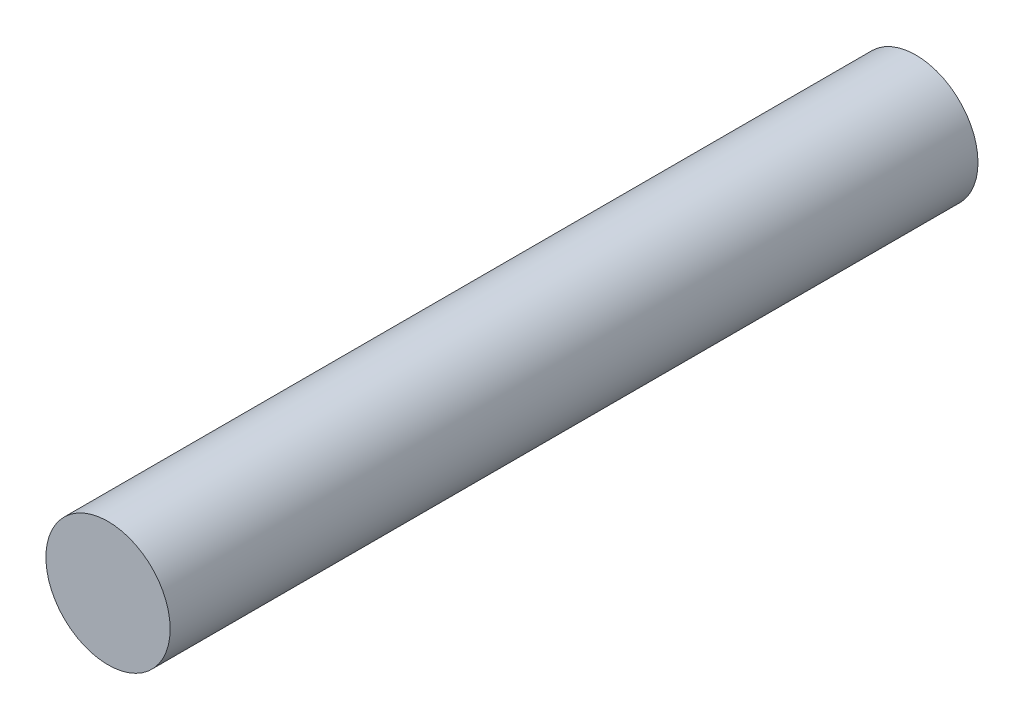
ISO-10303-21;
HEADER;
FILE_DESCRIPTION(('STEP AP214'),'2;1');
FILE_NAME('part.step','',(''),(''),'','','');
FILE_SCHEMA(('AUTOMOTIVE_DESIGN { 1 0 10303 214 1 1 1 1 }'));
ENDSEC;
DATA;
#1=APPLICATION_CONTEXT('core data for automotive mechanical design processes');
#2=APPLICATION_PROTOCOL_DEFINITION('international standard','automotive_design',2000,#1);
#3=PRODUCT_CONTEXT('',#1,'mechanical');
#4=PRODUCT('Part','Part','',(#3));
#5=PRODUCT_RELATED_PRODUCT_CATEGORY('part','',(#4));
#6=PRODUCT_DEFINITION_FORMATION('','',#4);
#7=PRODUCT_DEFINITION_CONTEXT('part definition',#1,'design');
#8=PRODUCT_DEFINITION('design','',#6,#7);
#9=PRODUCT_DEFINITION_SHAPE('','',#8);
#10=(LENGTH_UNIT() NAMED_UNIT(*) SI_UNIT(.MILLI.,.METRE.));
#11=(NAMED_UNIT(*) PLANE_ANGLE_UNIT() SI_UNIT($,.RADIAN.));
#12=(NAMED_UNIT(*) SI_UNIT($,.STERADIAN.) SOLID_ANGLE_UNIT());
#13=UNCERTAINTY_MEASURE_WITH_UNIT(LENGTH_MEASURE(1.E-05),#10,'distance_accuracy_value','');
#14=(GEOMETRIC_REPRESENTATION_CONTEXT(3) GLOBAL_UNCERTAINTY_ASSIGNED_CONTEXT((#13)) GLOBAL_UNIT_ASSIGNED_CONTEXT((#10,
#11,#12)) REPRESENTATION_CONTEXT('',''));
#15=CARTESIAN_POINT('',(0.,0.,0.));
#16=DIRECTION('',(0.,0.,1.));
#17=DIRECTION('',(1.,0.,0.));
#18=AXIS2_PLACEMENT_3D('',#15,#16,#17);
#19=CARTESIAN_POINT('',(0.,0.,-152.4));
#20=DIRECTION('',(0.,0.,1.));
#21=DIRECTION('',(1.,0.,0.));
#22=AXIS2_PLACEMENT_3D('',#19,#20,#21);
#23=CYLINDRICAL_SURFACE('',#22,12.7);
#24=CARTESIAN_POINT('',(0.,0.,-152.4));
#25=DIRECTION('',(0.,0.,1.));
#26=DIRECTION('',(1.,0.,0.));
#27=AXIS2_PLACEMENT_3D('',#24,#25,#26);
#28=CIRCLE('',#27,12.7);
#29=CARTESIAN_POINT('',(12.7,0.,-152.4));
#30=VERTEX_POINT('',#29);
#31=EDGE_CURVE('E10',#30,#30,#28,.T.);
#32=ORIENTED_EDGE('',*,*,#31,.T.);
#33=EDGE_LOOP('',(#32));
#34=FACE_BOUND('',#33,.T.);
#35=CARTESIAN_POINT('',(0.,0.,12.7));
#36=DIRECTION('',(0.,0.,1.));
#37=DIRECTION('',(1.,0.,0.));
#38=AXIS2_PLACEMENT_3D('',#35,#36,#37);
#39=CIRCLE('',#38,12.7);
#40=CARTESIAN_POINT('',(12.7,0.,12.7));
#41=VERTEX_POINT('',#40);
#42=EDGE_CURVE('E41',#41,#41,#39,.T.);
#43=ORIENTED_EDGE('',*,*,#42,.F.);
#44=EDGE_LOOP('',(#43));
#45=FACE_BOUND('',#44,.T.);
#46=ADVANCED_FACE('F35',(#34,#45),#23,.T.);
#47=CARTESIAN_POINT('',(0.,0.,-152.4));
#48=DIRECTION('',(0.,0.,1.));
#49=DIRECTION('',(1.,0.,0.));
#50=AXIS2_PLACEMENT_3D('',#47,#48,#49);
#51=PLANE('',#50);
#52=ORIENTED_EDGE('',*,*,#31,.F.);
#53=EDGE_LOOP('',(#52));
#54=FACE_BOUND('',#53,.T.);
#55=ADVANCED_FACE('F50',(#54),#51,.F.);
#56=CARTESIAN_POINT('',(0.,0.,12.7));
#57=DIRECTION('',(0.,0.,1.));
#58=DIRECTION('',(1.,0.,0.));
#59=AXIS2_PLACEMENT_3D('',#56,#57,#58);
#60=PLANE('',#59);
#61=ORIENTED_EDGE('',*,*,#42,.T.);
#62=EDGE_LOOP('',(#61));
#63=FACE_BOUND('',#62,.T.);
#64=ADVANCED_FACE('F47',(#63),#60,.T.);
#65=CLOSED_SHELL('',(#46,#55,#64));
#66=MANIFOLD_SOLID_BREP('B2',#65);
#67=ADVANCED_BREP_SHAPE_REPRESENTATION('',(#18,#66),#14);
#68=SHAPE_DEFINITION_REPRESENTATION(#9,#67);
ENDSEC;
END-ISO-10303-21;
